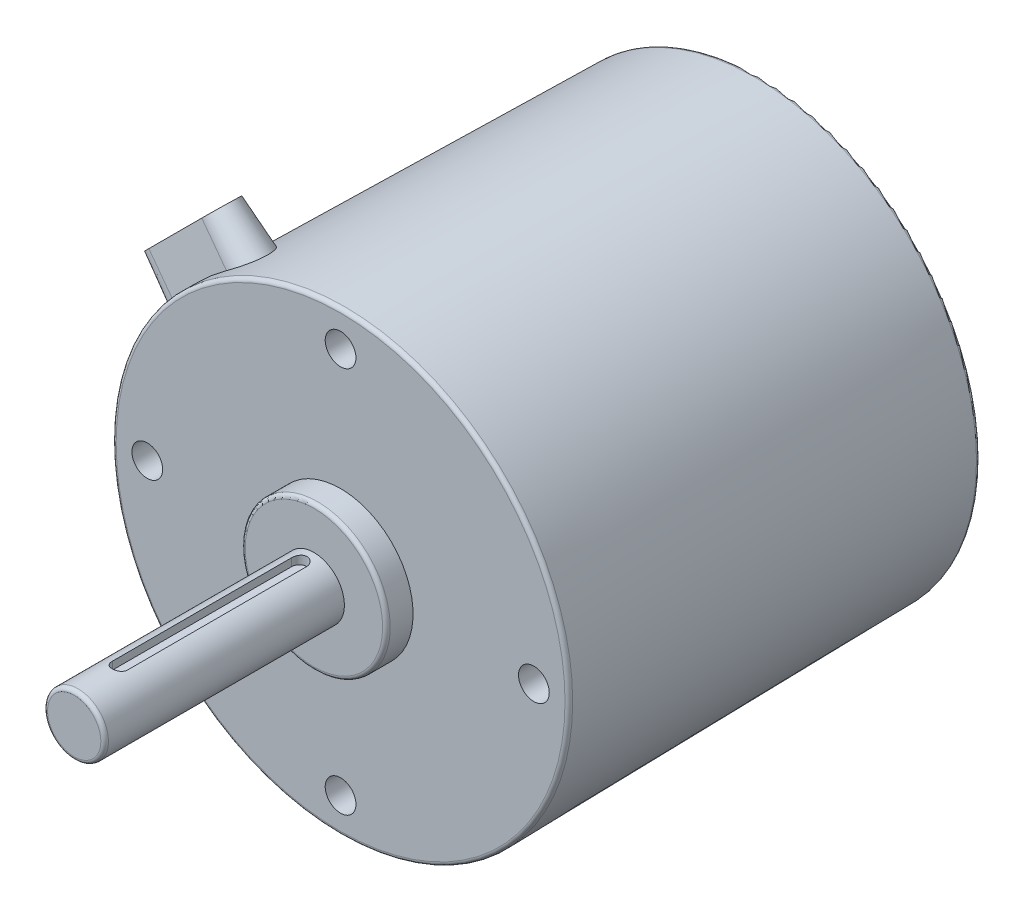
ISO-10303-21;
HEADER;
FILE_DESCRIPTION(('STEP AP214'),'2;1');
FILE_NAME('part.step','',(''),(''),'','','');
FILE_SCHEMA(('AUTOMOTIVE_DESIGN { 1 0 10303 214 1 1 1 1 }'));
ENDSEC;
DATA;
#1=APPLICATION_CONTEXT('core data for automotive mechanical design processes');
#2=APPLICATION_PROTOCOL_DEFINITION('international standard','automotive_design',2000,#1);
#3=PRODUCT_CONTEXT('',#1,'mechanical');
#4=PRODUCT('Part','Part','',(#3));
#5=PRODUCT_RELATED_PRODUCT_CATEGORY('part','',(#4));
#6=PRODUCT_DEFINITION_FORMATION('','',#4);
#7=PRODUCT_DEFINITION_CONTEXT('part definition',#1,'design');
#8=PRODUCT_DEFINITION('design','',#6,#7);
#9=PRODUCT_DEFINITION_SHAPE('','',#8);
#10=(LENGTH_UNIT() NAMED_UNIT(*) SI_UNIT(.MILLI.,.METRE.));
#11=(NAMED_UNIT(*) PLANE_ANGLE_UNIT() SI_UNIT($,.RADIAN.));
#12=(NAMED_UNIT(*) SI_UNIT($,.STERADIAN.) SOLID_ANGLE_UNIT());
#13=UNCERTAINTY_MEASURE_WITH_UNIT(LENGTH_MEASURE(1.E-05),#10,'distance_accuracy_value','');
#14=(GEOMETRIC_REPRESENTATION_CONTEXT(3) GLOBAL_UNCERTAINTY_ASSIGNED_CONTEXT((#13)) GLOBAL_UNIT_ASSIGNED_CONTEXT((#10,
#11,#12)) REPRESENTATION_CONTEXT('',''));
#15=CARTESIAN_POINT('',(0.,0.,0.));
#16=DIRECTION('',(0.,0.,1.));
#17=DIRECTION('',(1.,0.,0.));
#18=AXIS2_PLACEMENT_3D('',#15,#16,#17);
#19=CARTESIAN_POINT('',(0.,2.85,29.));
#20=DIRECTION('',(0.,1.,0.));
#21=DIRECTION('',(0.,0.,1.));
#22=AXIS2_PLACEMENT_3D('',#19,#20,#21);
#23=PLANE('',#22);
#24=DIRECTION('',(0.,0.,1.));
#25=VECTOR('',#24,1.);
#26=CARTESIAN_POINT('',(-1.,2.85,29.));
#27=LINE('',#26,#25);
#28=CARTESIAN_POINT('',(-1.,2.85,5.42));
#29=VERTEX_POINT('',#28);
#30=CARTESIAN_POINT('',(-1.,2.85,29.));
#31=VERTEX_POINT('',#30);
#32=EDGE_CURVE('E231',#29,#31,#27,.T.);
#33=ORIENTED_EDGE('',*,*,#32,.T.);
#34=CARTESIAN_POINT('',(0.,2.85,29.));
#35=DIRECTION('',(0.,1.,0.));
#36=DIRECTION('',(0.,0.,1.));
#37=AXIS2_PLACEMENT_3D('',#34,#35,#36);
#38=CIRCLE('',#37,1.);
#39=CARTESIAN_POINT('',(1.,2.85,29.));
#40=VERTEX_POINT('',#39);
#41=EDGE_CURVE('E126',#31,#40,#38,.T.);
#42=ORIENTED_EDGE('',*,*,#41,.T.);
#43=DIRECTION('',(0.,0.,-1.));
#44=VECTOR('',#43,1.);
#45=CARTESIAN_POINT('',(1.,2.85,29.));
#46=LINE('',#45,#44);
#47=CARTESIAN_POINT('',(1.,2.85,5.42));
#48=VERTEX_POINT('',#47);
#49=EDGE_CURVE('E121',#40,#48,#46,.T.);
#50=ORIENTED_EDGE('',*,*,#49,.T.);
#51=CARTESIAN_POINT('',(0.,2.85,5.42));
#52=DIRECTION('',(0.,1.,0.));
#53=DIRECTION('',(0.,0.,1.));
#54=AXIS2_PLACEMENT_3D('',#51,#52,#53);
#55=CIRCLE('',#54,1.);
#56=EDGE_CURVE('E123',#48,#29,#55,.T.);
#57=ORIENTED_EDGE('',*,*,#56,.T.);
#58=EDGE_LOOP('',(#33,#42,#50,#57));
#59=FACE_BOUND('',#58,.T.);
#60=ADVANCED_FACE('F16',(#59),#23,.T.);
#61=CARTESIAN_POINT('',(0.,0.,35.));
#62=DIRECTION('',(0.,0.,1.));
#63=DIRECTION('',(1.,0.,0.));
#64=AXIS2_PLACEMENT_3D('',#61,#62,#63);
#65=PLANE('',#64);
#66=CARTESIAN_POINT('',(0.,0.,35.));
#67=DIRECTION('',(0.,0.,-1.));
#68=DIRECTION('',(1.,0.,0.));
#69=AXIS2_PLACEMENT_3D('',#66,#67,#68);
#70=CIRCLE('',#69,3.5);
#71=CARTESIAN_POINT('',(3.5,0.,35.));
#72=VERTEX_POINT('',#71);
#73=CARTESIAN_POINT('',(0.,-3.5,35.));
#74=VERTEX_POINT('',#73);
#75=EDGE_CURVE('E232',#72,#74,#70,.T.);
#76=ORIENTED_EDGE('',*,*,#75,.F.);
#77=CARTESIAN_POINT('',(0.,0.,35.));
#78=DIRECTION('',(0.,0.,-1.));
#79=DIRECTION('',(0.,1.,0.));
#80=AXIS2_PLACEMENT_3D('',#77,#78,#79);
#81=CIRCLE('',#80,3.5);
#82=CARTESIAN_POINT('',(0.,3.5,35.));
#83=VERTEX_POINT('',#82);
#84=EDGE_CURVE('E187',#83,#72,#81,.T.);
#85=ORIENTED_EDGE('',*,*,#84,.F.);
#86=CARTESIAN_POINT('',(0.,0.,35.));
#87=DIRECTION('',(0.,0.,-1.));
#88=DIRECTION('',(-1.,0.,0.));
#89=AXIS2_PLACEMENT_3D('',#86,#87,#88);
#90=CIRCLE('',#89,3.5);
#91=CARTESIAN_POINT('',(-3.5,0.,35.));
#92=VERTEX_POINT('',#91);
#93=EDGE_CURVE('E153',#92,#83,#90,.T.);
#94=ORIENTED_EDGE('',*,*,#93,.F.);
#95=CARTESIAN_POINT('',(0.,0.,35.));
#96=DIRECTION('',(0.,0.,-1.));
#97=DIRECTION('',(0.,-1.,0.));
#98=AXIS2_PLACEMENT_3D('',#95,#96,#97);
#99=CIRCLE('',#98,3.5);
#100=EDGE_CURVE('E234',#74,#92,#99,.T.);
#101=ORIENTED_EDGE('',*,*,#100,.F.);
#102=EDGE_LOOP('',(#76,#85,#94,#101));
#103=FACE_BOUND('',#102,.T.);
#104=ADVANCED_FACE('F159',(#103),#65,.T.);
#105=CARTESIAN_POINT('',(0.,2.85,5.42));
#106=DIRECTION('',(0.,1.,0.));
#107=DIRECTION('',(0.,0.,1.));
#108=AXIS2_PLACEMENT_3D('',#105,#106,#107);
#109=CYLINDRICAL_SURFACE('',#108,1.);
#110=CARTESIAN_POINT('',(-1.,3.87298334620742,5.41999999999999));
#111=CARTESIAN_POINT('',(-1.00000033749611,3.87298148580177,5.39233701489345));
#112=CARTESIAN_POINT('',(-0.998851407375367,3.87328009949471,5.36468773698176));
#113=CARTESIAN_POINT('',(-0.994271295395754,3.87445904774559,5.30959596469643));
#114=CARTESIAN_POINT('',(-0.990840497572679,3.87533928441687,5.2821534363129));
#115=CARTESIAN_POINT('',(-0.977175239382526,3.87881710972054,5.20054682679115));
#116=CARTESIAN_POINT('',(-0.963567695172493,3.88225203148809,5.14694353151778));
#117=CARTESIAN_POINT('',(-0.927798076247996,3.89095422588003,5.04287532621803));
#118=CARTESIAN_POINT('',(-0.905636805423835,3.8962213263093,4.99241012178714));
#119=CARTESIAN_POINT('',(-0.853415378025864,3.90799134471939,4.89588855135267));
#120=CARTESIAN_POINT('',(-0.82335310335693,3.91449459395647,4.84983337210903));
#121=CARTESIAN_POINT('',(-0.755484471828066,3.92816262398025,4.76245611809389));
#122=CARTESIAN_POINT('',(-0.717537268783973,3.93533791028916,4.72124511375447));
#123=CARTESIAN_POINT('',(-0.635275780516227,3.94945104396194,4.64569791051729));
#124=CARTESIAN_POINT('',(-0.590960479478827,3.95638885322537,4.61136281053205));
#125=CARTESIAN_POINT('',(-0.496456899401686,3.96936182283248,4.55008899838135));
#126=CARTESIAN_POINT('',(-0.446195340334469,3.9753830468173,4.52326010401602));
#127=CARTESIAN_POINT('',(-0.341702590842914,3.98572346250589,4.47847526580329));
#128=CARTESIAN_POINT('',(-0.287472184083004,3.99004298914701,4.46051757570016));
#129=CARTESIAN_POINT('',(-0.177744108525155,3.99641900005128,4.43434100722256));
#130=CARTESIAN_POINT('',(-0.122294322002852,3.99851952901301,4.42593232757717));
#131=CARTESIAN_POINT('',(-0.0107327756816736,4.00037438150816,4.4184966284567));
#132=CARTESIAN_POINT('',(0.0453789000287116,4.00012899993445,4.41946842980766));
#133=CARTESIAN_POINT('',(0.155352492972102,3.99735237365736,4.43062996368545));
#134=CARTESIAN_POINT('',(0.209236701739861,3.99487198677361,4.44061461659948));
#135=CARTESIAN_POINT('',(0.314538711084345,3.98796330636496,4.46918867918275));
#136=CARTESIAN_POINT('',(0.365956402423993,3.98353492665556,4.48777846956858));
#137=CARTESIAN_POINT('',(0.465407286024544,3.97314997761798,4.53320128067065));
#138=CARTESIAN_POINT('',(0.513405629602253,3.96717993827555,4.56010739423284));
#139=CARTESIAN_POINT('',(0.604276631230019,3.95435945541919,4.62134312983347));
#140=CARTESIAN_POINT('',(0.647148515562294,3.94750887933198,4.65567387025322));
#141=CARTESIAN_POINT('',(0.727769389708495,3.93345566022865,4.73187891208131));
#142=CARTESIAN_POINT('',(0.765349103054131,3.92624850477685,4.77393163653981));
#143=CARTESIAN_POINT('',(0.832969575186241,3.91246168284006,4.86382986692774));
#144=CARTESIAN_POINT('',(0.863008270245065,3.90588218842993,4.91167695328356));
#145=CARTESIAN_POINT('',(0.914804709285965,3.89407813586325,5.01214559782377));
#146=CARTESIAN_POINT('',(0.936517017887272,3.88886106009137,5.06479146489609));
#147=CARTESIAN_POINT('',(0.970702351849831,3.88047058807055,5.17311692841829));
#148=CARTESIAN_POINT('',(0.983189189212133,3.87729413761435,5.22879185514985));
#149=CARTESIAN_POINT('',(0.993904635150938,3.87455290681524,5.3074573807589));
#150=CARTESIAN_POINT('',(0.996190790966709,3.8739652311086,5.32991970321318));
#151=CARTESIAN_POINT('',(0.999236757697394,3.87318062488975,5.37491778990932));
#152=CARTESIAN_POINT('',(0.999999038096046,3.87298306219461,5.39745337595529));
#153=CARTESIAN_POINT('',(1.,3.87298334620742,5.42));
#154=B_SPLINE_CURVE_WITH_KNOTS('',3,(#110,#111,#112,#113,#114,#115,#116,#117,#118,#119,#120,
#121,#122,#123,#124,#125,#126,#127,#128,#129,#130,#131,#132,#133,#134,#135,#136,#137,#138,#139,
#140,#141,#142,#143,#144,#145,#146,#147,#148,#149,#150,#151,#152,#153),.UNSPECIFIED.,.F.,.F.,(4,
2,2,2,2,2,2,2,2,2,2,2,2,2,2,2,2,2,2,2,2,4),(0.,0.0829365303397693,0.165859106084651,
0.331229963080318,0.496585282091499,0.66198497472675,0.830641897427976,0.999325753539195,
1.17036187098235,1.34136430732425,1.50890481515325,1.67642426256639,1.84022545479276,
2.00403389475838,2.16932509450377,2.33464120964329,2.50441429534542,2.67423379180968,
2.84496720161068,3.01544447539986,3.08315848722648,3.15076267731671),.UNSPECIFIED.);
#155=CARTESIAN_POINT('',(-1.,3.87298334620742,5.41999999999999));
#156=VERTEX_POINT('',#155);
#157=CARTESIAN_POINT('',(1.,3.87298334620742,5.42));
#158=VERTEX_POINT('',#157);
#159=EDGE_CURVE('E235',#156,#158,#154,.T.);
#160=ORIENTED_EDGE('',*,*,#159,.F.);
#161=DIRECTION('',(0.,1.,0.));
#162=VECTOR('',#161,1.);
#163=CARTESIAN_POINT('',(-1.,2.85,5.41999999999999));
#164=LINE('',#163,#162);
#165=EDGE_CURVE('E137',#156,#29,#164,.F.);
#166=ORIENTED_EDGE('',*,*,#165,.T.);
#167=ORIENTED_EDGE('',*,*,#56,.F.);
#168=DIRECTION('',(0.,1.,0.));
#169=VECTOR('',#168,1.);
#170=CARTESIAN_POINT('',(1.,2.85,5.42));
#171=LINE('',#170,#169);
#172=EDGE_CURVE('E131',#48,#158,#171,.T.);
#173=ORIENTED_EDGE('',*,*,#172,.T.);
#174=EDGE_LOOP('',(#160,#166,#167,#173));
#175=FACE_BOUND('',#174,.T.);
#176=ADVANCED_FACE('F134',(#175),#109,.F.);
#177=CARTESIAN_POINT('',(1.,2.85,29.));
#178=DIRECTION('',(1.,0.,0.));
#179=DIRECTION('',(0.,0.,-1.));
#180=AXIS2_PLACEMENT_3D('',#177,#178,#179);
#181=PLANE('',#180);
#182=DIRECTION('',(0.,0.,-1.));
#183=VECTOR('',#182,1.);
#184=CARTESIAN_POINT('',(1.,3.87298334620742,81.3137084989848));
#185=LINE('',#184,#183);
#186=CARTESIAN_POINT('',(1.,3.87298334620742,29.));
#187=VERTEX_POINT('',#186);
#188=EDGE_CURVE('E142',#158,#187,#185,.F.);
#189=ORIENTED_EDGE('',*,*,#188,.F.);
#190=ORIENTED_EDGE('',*,*,#172,.F.);
#191=ORIENTED_EDGE('',*,*,#49,.F.);
#192=DIRECTION('',(0.,1.,0.));
#193=VECTOR('',#192,1.);
#194=CARTESIAN_POINT('',(1.,2.85,29.));
#195=LINE('',#194,#193);
#196=EDGE_CURVE('E144',#40,#187,#195,.T.);
#197=ORIENTED_EDGE('',*,*,#196,.T.);
#198=EDGE_LOOP('',(#189,#190,#191,#197));
#199=FACE_BOUND('',#198,.T.);
#200=ADVANCED_FACE('F140',(#199),#181,.F.);
#201=CARTESIAN_POINT('',(0.,2.85,29.));
#202=DIRECTION('',(0.,1.,0.));
#203=DIRECTION('',(0.,0.,1.));
#204=AXIS2_PLACEMENT_3D('',#201,#202,#203);
#205=CYLINDRICAL_SURFACE('',#204,1.);
#206=ORIENTED_EDGE('',*,*,#41,.F.);
#207=DIRECTION('',(0.,1.,0.));
#208=VECTOR('',#207,1.);
#209=CARTESIAN_POINT('',(-1.,2.85,29.));
#210=LINE('',#209,#208);
#211=CARTESIAN_POINT('',(-1.,3.87298334620742,29.));
#212=VERTEX_POINT('',#211);
#213=EDGE_CURVE('E230',#31,#212,#210,.T.);
#214=ORIENTED_EDGE('',*,*,#213,.T.);
#215=CARTESIAN_POINT('',(1.,3.87298334620742,29.));
#216=CARTESIAN_POINT('',(1.00000033683282,3.87298148578629,29.0276629618861));
#217=CARTESIAN_POINT('',(0.998851408973519,3.87328009898514,29.0553122166168));
#218=CARTESIAN_POINT('',(0.99427130530857,3.87445904529398,29.1104039432582));
#219=CARTESIAN_POINT('',(0.990840513520935,3.87533928052184,29.1378464491771));
#220=CARTESIAN_POINT('',(0.977175260843418,3.87881710393726,29.2194530833432));
#221=CARTESIAN_POINT('',(0.963567703685294,3.88225202757007,29.2730564246122));
#222=CARTESIAN_POINT('',(0.927797766664209,3.89095430304382,29.377125593587));
#223=CARTESIAN_POINT('',(0.905636046675286,3.8962215135378,29.4275916629555));
#224=CARTESIAN_POINT('',(0.853414285079078,3.90799157486739,29.5241130864299));
#225=CARTESIAN_POINT('',(0.823352404294531,3.91449471333242,29.5701674100591));
#226=CARTESIAN_POINT('',(0.755487979247936,3.92816193945039,29.6575394864378));
#227=CARTESIAN_POINT('',(0.717545201468672,3.93533648748831,29.6987466452781));
#228=CARTESIAN_POINT('',(0.635284227526788,3.94944965646412,29.774295287631));
#229=CARTESIAN_POINT('',(0.59096375271655,3.95638819197842,29.8086343067441));
#230=CARTESIAN_POINT('',(0.496434353262429,3.96936513280701,29.8699263913366));
#231=CARTESIAN_POINT('',(0.446150035120257,3.97538918749288,29.8967663594361));
#232=CARTESIAN_POINT('',(0.341642316384402,3.98572777190495,29.9415435234846));
#233=CARTESIAN_POINT('',(0.287423727052291,3.99004434937703,29.9594913901323));
#234=CARTESIAN_POINT('',(0.194111735626861,3.99546891720265,29.9817561327113));
#235=CARTESIAN_POINT('',(0.155632918020192,3.99715927898668,29.9885857933547));
#236=CARTESIAN_POINT('',(0.0781080027780891,3.99942531582646,29.9977085408135));
#237=CARTESIAN_POINT('',(0.039061913421891,4.00000100713419,30.0000016937716));
#238=CARTESIAN_POINT('',(-0.0552317459834105,3.99999857595865,29.999997605085));
#239=CARTESIAN_POINT('',(-0.110495128478854,3.99884417849432,29.9954072017814));
#240=CARTESIAN_POINT('',(-0.219452299234435,3.99434884496973,29.9771887284744));
#241=CARTESIAN_POINT('',(-0.273144540728275,3.99100582520556,29.9635520456883));
#242=CARTESIAN_POINT('',(-0.377348216031214,3.98250401525139,29.9277065776784));
#243=CARTESIAN_POINT('',(-0.42786388192617,3.97734770399773,29.9055094913299));
#244=CARTESIAN_POINT('',(-0.524450982676887,3.96576858613919,29.8532106110736));
#245=CARTESIAN_POINT('',(-0.570522530531435,3.9593458117488,29.8231090182229));
#246=CARTESIAN_POINT('',(-0.657866871057287,3.94578291730051,29.7552003629653));
#247=CARTESIAN_POINT('',(-0.699035148909379,3.93863172676562,29.7172610821916));
#248=CARTESIAN_POINT('',(-0.774497762760067,3.92449111086287,29.6350335448416));
#249=CARTESIAN_POINT('',(-0.808791004318433,3.917501711407,29.59074427933));
#250=CARTESIAN_POINT('',(-0.870026617564658,3.90436326544461,29.4962571540367));
#251=CARTESIAN_POINT('',(-0.896849892050566,3.89822853701072,29.4459800204073));
#252=CARTESIAN_POINT('',(-0.941609493202656,3.88766043493568,29.3414633719414));
#253=CARTESIAN_POINT('',(-0.959552492279168,3.88322578446617,29.2872268673445));
#254=CARTESIAN_POINT('',(-0.981793057388554,3.87765011739136,29.1939162001483));
#255=CARTESIAN_POINT('',(-0.988610024876979,3.87591131774124,29.1554596460299));
#256=CARTESIAN_POINT('',(-0.997716332082784,3.87357302813837,29.0780089785749));
#257=CARTESIAN_POINT('',(-1.00000893261029,3.87297271766376,29.0390152728012));
#258=CARTESIAN_POINT('',(-1.,3.87298334620742,29.));
#259=B_SPLINE_CURVE_WITH_KNOTS('',3,(#215,#216,#217,#218,#219,#220,#221,#222,#223,#224,#225,
#226,#227,#228,#229,#230,#231,#232,#233,#234,#235,#236,#237,#238,#239,#240,#241,#242,#243,#244,
#245,#246,#247,#248,#249,#250,#251,#252,#253,#254,#255,#256,#257,#258),.UNSPECIFIED.,.F.,.F.,(4,
2,2,2,2,2,2,2,2,2,2,2,2,2,2,2,2,2,2,2,2,4),(0.,0.0829364608197415,0.165858967679138,
0.331229962709977,0.496588203456508,0.661984974171244,0.830625162094531,0.999325752711569,
1.17044795789403,1.34136431261154,1.45844938979969,1.57553275986414,1.74108325106594,
1.90679158624143,2.07227425793992,2.23775272086786,2.40629176845253,2.57485762457944,
2.74597444954044,2.91696250578419,3.03398040676349,3.15091393953945),.UNSPECIFIED.);
#260=EDGE_CURVE('E239',#187,#212,#259,.T.);
#261=ORIENTED_EDGE('',*,*,#260,.F.);
#262=ORIENTED_EDGE('',*,*,#196,.F.);
#263=EDGE_LOOP('',(#206,#214,#261,#262));
#264=FACE_BOUND('',#263,.T.);
#265=ADVANCED_FACE('F576',(#264),#205,.F.);
#266=CARTESIAN_POINT('',(-1.,2.85,29.));
#267=DIRECTION('',(-1.,0.,0.));
#268=DIRECTION('',(0.,0.,1.));
#269=AXIS2_PLACEMENT_3D('',#266,#267,#268);
#270=PLANE('',#269);
#271=DIRECTION('',(0.,0.,-1.));
#272=VECTOR('',#271,1.);
#273=CARTESIAN_POINT('',(-1.,3.87298334620742,81.3137084989848));
#274=LINE('',#273,#272);
#275=EDGE_CURVE('E229',#212,#156,#274,.T.);
#276=ORIENTED_EDGE('',*,*,#275,.F.);
#277=ORIENTED_EDGE('',*,*,#213,.F.);
#278=ORIENTED_EDGE('',*,*,#32,.F.);
#279=ORIENTED_EDGE('',*,*,#165,.F.);
#280=EDGE_LOOP('',(#276,#277,#278,#279));
#281=FACE_BOUND('',#280,.T.);
#282=ADVANCED_FACE('F214',(#281),#270,.F.);
#283=CARTESIAN_POINT('',(0.,0.,34.5));
#284=DIRECTION('',(0.,0.,1.));
#285=DIRECTION('',(0.,-1.,0.));
#286=AXIS2_PLACEMENT_3D('',#283,#284,#285);
#287=TOROIDAL_SURFACE('',#286,3.5,0.5);
#288=CARTESIAN_POINT('',(0.,0.,34.5));
#289=DIRECTION('',(0.,0.,-1.));
#290=DIRECTION('',(-1.,0.,0.));
#291=AXIS2_PLACEMENT_3D('',#288,#289,#290);
#292=CIRCLE('',#291,4.);
#293=CARTESIAN_POINT('',(-4.,0.,34.5));
#294=VERTEX_POINT('',#293);
#295=EDGE_CURVE('E225',#294,#294,#292,.T.);
#296=ORIENTED_EDGE('',*,*,#295,.F.);
#297=EDGE_LOOP('',(#296));
#298=FACE_BOUND('',#297,.T.);
#299=ORIENTED_EDGE('',*,*,#100,.T.);
#300=ORIENTED_EDGE('',*,*,#93,.T.);
#301=ORIENTED_EDGE('',*,*,#84,.T.);
#302=ORIENTED_EDGE('',*,*,#75,.T.);
#303=EDGE_LOOP('',(#299,#300,#301,#302));
#304=FACE_BOUND('',#303,.T.);
#305=ADVANCED_FACE('F202',(#298,#304),#287,.T.);
#306=CARTESIAN_POINT('',(0.,0.,81.3137084989848));
#307=DIRECTION('',(0.,0.,-1.));
#308=DIRECTION('',(-1.,0.,0.));
#309=AXIS2_PLACEMENT_3D('',#306,#307,#308);
#310=CYLINDRICAL_SURFACE('',#309,4.);
#311=CARTESIAN_POINT('',(0.,0.,3.5));
#312=DIRECTION('',(0.,0.,-1.));
#313=DIRECTION('',(-1.,0.,0.));
#314=AXIS2_PLACEMENT_3D('',#311,#312,#313);
#315=CIRCLE('',#314,4.);
#316=CARTESIAN_POINT('',(-4.,0.,3.5));
#317=VERTEX_POINT('',#316);
#318=EDGE_CURVE('E228',#317,#317,#315,.T.);
#319=ORIENTED_EDGE('',*,*,#318,.F.);
#320=EDGE_LOOP('',(#319));
#321=FACE_BOUND('',#320,.T.);
#322=ORIENTED_EDGE('',*,*,#295,.T.);
#323=EDGE_LOOP('',(#322));
#324=FACE_BOUND('',#323,.T.);
#325=ORIENTED_EDGE('',*,*,#260,.T.);
#326=ORIENTED_EDGE('',*,*,#275,.T.);
#327=ORIENTED_EDGE('',*,*,#159,.T.);
#328=ORIENTED_EDGE('',*,*,#188,.T.);
#329=EDGE_LOOP('',(#325,#326,#327,#328));
#330=FACE_BOUND('',#329,.T.);
#331=ADVANCED_FACE('F213',(#321,#324,#330),#310,.T.);
#332=CARTESIAN_POINT('',(0.,0.,3.5));
#333=DIRECTION('',(0.,0.,1.));
#334=DIRECTION('',(1.,0.,0.));
#335=AXIS2_PLACEMENT_3D('',#332,#333,#334);
#336=PLANE('',#335);
#337=ORIENTED_EDGE('',*,*,#318,.T.);
#338=EDGE_LOOP('',(#337));
#339=FACE_BOUND('',#338,.T.);
#340=CARTESIAN_POINT('',(0.,0.,3.5));
#341=DIRECTION('',(0.,0.,-1.));
#342=DIRECTION('',(-1.,0.,0.));
#343=AXIS2_PLACEMENT_3D('',#340,#341,#342);
#344=CIRCLE('',#343,9.025);
#345=CARTESIAN_POINT('',(-9.025,0.,3.5));
#346=VERTEX_POINT('',#345);
#347=CARTESIAN_POINT('',(9.025,0.,3.5));
#348=VERTEX_POINT('',#347);
#349=EDGE_CURVE('E481',#346,#348,#344,.T.);
#350=ORIENTED_EDGE('',*,*,#349,.F.);
#351=CARTESIAN_POINT('',(0.,0.,3.5));
#352=DIRECTION('',(0.,0.,-1.));
#353=DIRECTION('',(1.,0.,0.));
#354=AXIS2_PLACEMENT_3D('',#351,#352,#353);
#355=CIRCLE('',#354,9.025);
#356=EDGE_CURVE('E497',#348,#346,#355,.T.);
#357=ORIENTED_EDGE('',*,*,#356,.F.);
#358=EDGE_LOOP('',(#350,#357));
#359=FACE_BOUND('',#358,.T.);
#360=ADVANCED_FACE('F501',(#339,#359),#336,.T.);
#361=CARTESIAN_POINT('',(0.,25.4,-5.50000000004047));
#362=DIRECTION('',(0.,0.,1.));
#363=DIRECTION('',(1.,0.,0.));
#364=AXIS2_PLACEMENT_3D('',#361,#362,#363);
#365=CONICAL_SURFACE('',#364,2.0192999998585,1.02974425846506);
#366=CARTESIAN_POINT('',(0.,25.4,-6.71331784838003));
#367=VERTEX_POINT('',#366);
#368=VERTEX_LOOP('',#367);
#369=FACE_BOUND('',#368,.T.);
#370=CARTESIAN_POINT('',(0.,25.4,-5.5));
#371=DIRECTION('',(0.,0.,1.));
#372=DIRECTION('',(1.,0.,0.));
#373=AXIS2_PLACEMENT_3D('',#370,#371,#372);
#374=CIRCLE('',#373,2.01929999999999);
#375=CARTESIAN_POINT('',(2.0193,25.4,-5.5));
#376=VERTEX_POINT('',#375);
#377=EDGE_CURVE('E502',#376,#376,#374,.T.);
#378=ORIENTED_EDGE('',*,*,#377,.T.);
#379=EDGE_LOOP('',(#378));
#380=FACE_BOUND('',#379,.T.);
#381=ADVANCED_FACE('F517',(#369,#380),#365,.F.);
#382=CARTESIAN_POINT('',(25.4,0.,-5.50000000004047));
#383=DIRECTION('',(0.,0.,1.));
#384=DIRECTION('',(1.,0.,0.));
#385=AXIS2_PLACEMENT_3D('',#382,#383,#384);
#386=CONICAL_SURFACE('',#385,2.01929999990589,1.02974425838645);
#387=CARTESIAN_POINT('',(25.4000000000758,0.,-6.71331784849372));
#388=VERTEX_POINT('',#387);
#389=VERTEX_LOOP('',#388);
#390=FACE_BOUND('',#389,.T.);
#391=CARTESIAN_POINT('',(25.4,0.,-5.5));
#392=DIRECTION('',(0.,0.,1.));
#393=DIRECTION('',(1.,0.,0.));
#394=AXIS2_PLACEMENT_3D('',#391,#392,#393);
#395=CIRCLE('',#394,2.01929999999999);
#396=CARTESIAN_POINT('',(27.4193,0.,-5.5));
#397=VERTEX_POINT('',#396);
#398=EDGE_CURVE('E539',#397,#397,#395,.T.);
#399=ORIENTED_EDGE('',*,*,#398,.T.);
#400=EDGE_LOOP('',(#399));
#401=FACE_BOUND('',#400,.T.);
#402=ADVANCED_FACE('F522',(#390,#401),#386,.F.);
#403=CARTESIAN_POINT('',(0.,-25.4,-5.50000000004047));
#404=DIRECTION('',(0.,0.,1.));
#405=DIRECTION('',(1.,0.,0.));
#406=AXIS2_PLACEMENT_3D('',#403,#404,#405);
#407=CONICAL_SURFACE('',#406,2.0192999998585,1.02974425846506);
#408=CARTESIAN_POINT('',(0.,-25.4,-6.71331784838003));
#409=VERTEX_POINT('',#408);
#410=VERTEX_LOOP('',#409);
#411=FACE_BOUND('',#410,.T.);
#412=CARTESIAN_POINT('',(0.,-25.4,-5.5));
#413=DIRECTION('',(0.,0.,1.));
#414=DIRECTION('',(1.,0.,0.));
#415=AXIS2_PLACEMENT_3D('',#412,#413,#414);
#416=CIRCLE('',#415,2.01929999999999);
#417=CARTESIAN_POINT('',(2.0193,-25.4,-5.5));
#418=VERTEX_POINT('',#417);
#419=EDGE_CURVE('E537',#418,#418,#416,.T.);
#420=ORIENTED_EDGE('',*,*,#419,.T.);
#421=EDGE_LOOP('',(#420));
#422=FACE_BOUND('',#421,.T.);
#423=ADVANCED_FACE('F525',(#411,#422),#407,.F.);
#424=CARTESIAN_POINT('',(-25.4,0.,-5.50000000009732));
#425=DIRECTION('',(0.,0.,1.));
#426=DIRECTION('',(1.,0.,0.));
#427=AXIS2_PLACEMENT_3D('',#424,#425,#426);
#428=CONICAL_SURFACE('',#427,2.01929999975427,1.0297442583699);
#429=CARTESIAN_POINT('',(-25.3999999999053,0.,-6.71331784877793));
#430=VERTEX_POINT('',#429);
#431=VERTEX_LOOP('',#430);
#432=FACE_BOUND('',#431,.T.);
#433=CARTESIAN_POINT('',(-25.4,0.,-5.5));
#434=DIRECTION('',(0.,0.,1.));
#435=DIRECTION('',(1.,0.,0.));
#436=AXIS2_PLACEMENT_3D('',#433,#434,#435);
#437=CIRCLE('',#436,2.01929999999999);
#438=CARTESIAN_POINT('',(-23.3807,0.,-5.5));
#439=VERTEX_POINT('',#438);
#440=EDGE_CURVE('E441',#439,#439,#437,.T.);
#441=ORIENTED_EDGE('',*,*,#440,.T.);
#442=EDGE_LOOP('',(#441));
#443=FACE_BOUND('',#442,.T.);
#444=ADVANCED_FACE('F452',(#432,#443),#428,.F.);
#445=CARTESIAN_POINT('',(0.,0.,3.));
#446=DIRECTION('',(0.,0.,1.));
#447=DIRECTION('',(1.,0.,0.));
#448=AXIS2_PLACEMENT_3D('',#445,#446,#447);
#449=TOROIDAL_SURFACE('',#448,9.025,0.500000000000001);
#450=CARTESIAN_POINT('',(0.,0.,3.));
#451=DIRECTION('',(0.,0.,-1.));
#452=DIRECTION('',(-1.,0.,0.));
#453=AXIS2_PLACEMENT_3D('',#450,#451,#452);
#454=CIRCLE('',#453,9.525);
#455=CARTESIAN_POINT('',(-9.525,0.,3.));
#456=VERTEX_POINT('',#455);
#457=EDGE_CURVE('E433',#456,#456,#454,.T.);
#458=ORIENTED_EDGE('',*,*,#457,.F.);
#459=EDGE_LOOP('',(#458));
#460=FACE_BOUND('',#459,.T.);
#461=ORIENTED_EDGE('',*,*,#356,.T.);
#462=ORIENTED_EDGE('',*,*,#349,.T.);
#463=EDGE_LOOP('',(#461,#462));
#464=FACE_BOUND('',#463,.T.);
#465=ADVANCED_FACE('F446',(#460,#464),#449,.T.);
#466=CARTESIAN_POINT('',(-28.1363670181608,21.2313063320783,-5.30190195474243));
#467=DIRECTION('',(-0.706999085398821,0.706999085398828,-0.0174524064372836));
#468=DIRECTION('',(-0.707106781186551,-0.707106781186544,0.));
#469=AXIS2_PLACEMENT_3D('',#466,#467,#468);
#470=PLANE('',#469);
#471=DIRECTION('',(0.707214460582744,0.706783775805259,-0.0174470914802136));
#472=VECTOR('',#471,1.);
#473=CARTESIAN_POINT('',(-28.1363670183226,21.1730039335373,-7.66373914380555));
#474=LINE('',#473,#472);
#475=CARTESIAN_POINT('',(-28.136367018929,21.1730039329562,-7.66373914479925));
#476=VERTEX_POINT('',#475);
#477=CARTESIAN_POINT('',(-21.3471081973529,27.9581281806545,-7.83123122371729));
#478=VERTEX_POINT('',#477);
#479=EDGE_CURVE('E434',#476,#478,#474,.T.);
#480=ORIENTED_EDGE('',*,*,#479,.F.);
#481=CARTESIAN_POINT('',(-28.1363670183494,21.2313063322669,-5.30190195474708));
#482=DIRECTION('',(0.706999085398823,-0.706999085398826,0.0174524064372831));
#483=DIRECTION('',(0.707106781186549,0.707106781186546,0.));
#484=AXIS2_PLACEMENT_3D('',#481,#482,#483);
#485=CIRCLE('',#484,2.36255668229862);
#486=CARTESIAN_POINT('',(-28.136367018286,21.2896087310604,-2.94006476570455));
#487=VERTEX_POINT('',#486);
#488=EDGE_CURVE('E566',#487,#476,#485,.T.);
#489=ORIENTED_EDGE('',*,*,#488,.F.);
#490=DIRECTION('',(-0.70721446059118,-0.706783775796902,0.0174470914768434));
#491=VECTOR('',#490,1.);
#492=CARTESIAN_POINT('',(-21.3471081967197,28.0747329786518,-3.10755684387409));
#493=LINE('',#492,#491);
#494=CARTESIAN_POINT('',(-21.3471081967079,28.07473297864,-3.10755684387696));
#495=VERTEX_POINT('',#494);
#496=EDGE_CURVE('E425',#495,#487,#493,.T.);
#497=ORIENTED_EDGE('',*,*,#496,.F.);
#498=CARTESIAN_POINT('',(-21.3471081966874,28.0164305799301,-5.46939403294529));
#499=DIRECTION('',(0.706999085398817,-0.706999085398832,0.0174524064372834));
#500=DIRECTION('',(0.707106781186555,0.70710678118654,0.));
#501=AXIS2_PLACEMENT_3D('',#498,#499,#500);
#502=CIRCLE('',#501,2.3625566823267);
#503=EDGE_CURVE('E563',#478,#495,#502,.T.);
#504=ORIENTED_EDGE('',*,*,#503,.F.);
#505=EDGE_LOOP('',(#480,#489,#497,#504));
#506=FACE_BOUND('',#505,.T.);
#507=ADVANCED_FACE('F451',(#506),#470,.T.);
#508=CARTESIAN_POINT('',(0.,25.4,0.));
#509=DIRECTION('',(0.,0.,1.));
#510=DIRECTION('',(1.,0.,0.));
#511=AXIS2_PLACEMENT_3D('',#508,#509,#510);
#512=CYLINDRICAL_SURFACE('',#511,2.01929999999999);
#513=ORIENTED_EDGE('',*,*,#377,.F.);
#514=EDGE_LOOP('',(#513));
#515=FACE_BOUND('',#514,.T.);
#516=CARTESIAN_POINT('',(0.,25.4,0.));
#517=DIRECTION('',(0.,0.,1.));
#518=DIRECTION('',(1.,0.,0.));
#519=AXIS2_PLACEMENT_3D('',#516,#517,#518);
#520=CIRCLE('',#519,2.01929999999999);
#521=CARTESIAN_POINT('',(2.0193,25.4,0.));
#522=VERTEX_POINT('',#521);
#523=EDGE_CURVE('E554',#522,#522,#520,.F.);
#524=ORIENTED_EDGE('',*,*,#523,.F.);
#525=EDGE_LOOP('',(#524));
#526=FACE_BOUND('',#525,.T.);
#527=ADVANCED_FACE('F548',(#515,#526),#512,.F.);
#528=CARTESIAN_POINT('',(25.4,0.,0.));
#529=DIRECTION('',(0.,0.,1.));
#530=DIRECTION('',(1.,0.,0.));
#531=AXIS2_PLACEMENT_3D('',#528,#529,#530);
#532=CYLINDRICAL_SURFACE('',#531,2.01929999999999);
#533=ORIENTED_EDGE('',*,*,#398,.F.);
#534=EDGE_LOOP('',(#533));
#535=FACE_BOUND('',#534,.T.);
#536=CARTESIAN_POINT('',(25.4,0.,0.));
#537=DIRECTION('',(0.,0.,1.));
#538=DIRECTION('',(1.,0.,0.));
#539=AXIS2_PLACEMENT_3D('',#536,#537,#538);
#540=CIRCLE('',#539,2.01929999999999);
#541=CARTESIAN_POINT('',(27.4193,0.,0.));
#542=VERTEX_POINT('',#541);
#543=EDGE_CURVE('E556',#542,#542,#540,.F.);
#544=ORIENTED_EDGE('',*,*,#543,.F.);
#545=EDGE_LOOP('',(#544));
#546=FACE_BOUND('',#545,.T.);
#547=ADVANCED_FACE('F551',(#535,#546),#532,.F.);
#548=CARTESIAN_POINT('',(0.,-25.4,0.));
#549=DIRECTION('',(0.,0.,1.));
#550=DIRECTION('',(1.,0.,0.));
#551=AXIS2_PLACEMENT_3D('',#548,#549,#550);
#552=CYLINDRICAL_SURFACE('',#551,2.01929999999999);
#553=ORIENTED_EDGE('',*,*,#419,.F.);
#554=EDGE_LOOP('',(#553));
#555=FACE_BOUND('',#554,.T.);
#556=CARTESIAN_POINT('',(0.,-25.4,0.));
#557=DIRECTION('',(0.,0.,1.));
#558=DIRECTION('',(1.,0.,0.));
#559=AXIS2_PLACEMENT_3D('',#556,#557,#558);
#560=CIRCLE('',#559,2.01929999999999);
#561=CARTESIAN_POINT('',(2.0193,-25.4,0.));
#562=VERTEX_POINT('',#561);
#563=EDGE_CURVE('E559',#562,#562,#560,.F.);
#564=ORIENTED_EDGE('',*,*,#563,.F.);
#565=EDGE_LOOP('',(#564));
#566=FACE_BOUND('',#565,.T.);
#567=ADVANCED_FACE('F697',(#555,#566),#552,.F.);
#568=CARTESIAN_POINT('',(-25.4,0.,0.));
#569=DIRECTION('',(0.,0.,1.));
#570=DIRECTION('',(1.,0.,0.));
#571=AXIS2_PLACEMENT_3D('',#568,#569,#570);
#572=CYLINDRICAL_SURFACE('',#571,2.01929999999999);
#573=ORIENTED_EDGE('',*,*,#440,.F.);
#574=EDGE_LOOP('',(#573));
#575=FACE_BOUND('',#574,.T.);
#576=CARTESIAN_POINT('',(-25.4,0.,0.));
#577=DIRECTION('',(0.,0.,1.));
#578=DIRECTION('',(1.,0.,0.));
#579=AXIS2_PLACEMENT_3D('',#576,#577,#578);
#580=CIRCLE('',#579,2.01929999999999);
#581=CARTESIAN_POINT('',(-23.3807,0.,0.));
#582=VERTEX_POINT('',#581);
#583=EDGE_CURVE('E807',#582,#582,#580,.F.);
#584=ORIENTED_EDGE('',*,*,#583,.F.);
#585=EDGE_LOOP('',(#584));
#586=FACE_BOUND('',#585,.T.);
#587=ADVANCED_FACE('F706',(#575,#586),#572,.F.);
#588=CARTESIAN_POINT('',(0.,0.,3.5));
#589=DIRECTION('',(0.,0.,-1.));
#590=DIRECTION('',(-1.,0.,0.));
#591=AXIS2_PLACEMENT_3D('',#588,#589,#590);
#592=CYLINDRICAL_SURFACE('',#591,9.525);
#593=ORIENTED_EDGE('',*,*,#457,.T.);
#594=EDGE_LOOP('',(#593));
#595=FACE_BOUND('',#594,.T.);
#596=CARTESIAN_POINT('',(0.,0.,0.));
#597=DIRECTION('',(0.,0.,-1.));
#598=DIRECTION('',(-1.,0.,0.));
#599=AXIS2_PLACEMENT_3D('',#596,#597,#598);
#600=CIRCLE('',#599,9.525);
#601=CARTESIAN_POINT('',(-9.525,0.,0.));
#602=VERTEX_POINT('',#601);
#603=EDGE_CURVE('E805',#602,#602,#600,.T.);
#604=ORIENTED_EDGE('',*,*,#603,.F.);
#605=EDGE_LOOP('',(#604));
#606=FACE_BOUND('',#605,.T.);
#607=ADVANCED_FACE('F372',(#595,#606),#592,.T.);
#608=CARTESIAN_POINT('',(0.,0.,-55.));
#609=DIRECTION('',(0.,0.,1.));
#610=DIRECTION('',(1.,0.,0.));
#611=AXIS2_PLACEMENT_3D('',#608,#609,#610);
#612=PLANE('',#611);
#613=CARTESIAN_POINT('',(0.,0.,-55.));
#614=DIRECTION('',(0.,0.,1.));
#615=DIRECTION('',(0.,1.,0.));
#616=AXIS2_PLACEMENT_3D('',#613,#614,#615);
#617=CIRCLE('',#616,28.5486227973902);
#618=CARTESIAN_POINT('',(0.,28.5486227973902,-55.));
#619=VERTEX_POINT('',#618);
#620=CARTESIAN_POINT('',(-28.5486227973902,0.,-55.));
#621=VERTEX_POINT('',#620);
#622=EDGE_CURVE('E258',#619,#621,#617,.T.);
#623=ORIENTED_EDGE('',*,*,#622,.F.);
#624=CARTESIAN_POINT('',(0.,0.,-55.));
#625=DIRECTION('',(0.,0.,1.));
#626=DIRECTION('',(1.,0.,0.));
#627=AXIS2_PLACEMENT_3D('',#624,#625,#626);
#628=CIRCLE('',#627,28.5486227973902);
#629=CARTESIAN_POINT('',(28.5486227973905,0.,-55.));
#630=VERTEX_POINT('',#629);
#631=EDGE_CURVE('E421',#630,#619,#628,.T.);
#632=ORIENTED_EDGE('',*,*,#631,.F.);
#633=CARTESIAN_POINT('',(0.,0.,-55.));
#634=DIRECTION('',(0.,0.,1.));
#635=DIRECTION('',(0.,-1.,0.));
#636=AXIS2_PLACEMENT_3D('',#633,#634,#635);
#637=CIRCLE('',#636,28.5486227973913);
#638=CARTESIAN_POINT('',(2.08468246512273E-08,-28.548622797391,-55.));
#639=VERTEX_POINT('',#638);
#640=EDGE_CURVE('E411',#639,#630,#637,.T.);
#641=ORIENTED_EDGE('',*,*,#640,.F.);
#642=CARTESIAN_POINT('',(0.,0.,-55.));
#643=DIRECTION('',(0.,0.,1.));
#644=DIRECTION('',(-1.,0.,0.));
#645=AXIS2_PLACEMENT_3D('',#642,#643,#644);
#646=CIRCLE('',#645,28.5486227973902);
#647=EDGE_CURVE('E399',#621,#639,#646,.T.);
#648=ORIENTED_EDGE('',*,*,#647,.F.);
#649=EDGE_LOOP('',(#623,#632,#641,#648));
#650=FACE_BOUND('',#649,.T.);
#651=ADVANCED_FACE('F367',(#650),#612,.F.);
#652=CARTESIAN_POINT('',(-24.6013715911667,17.7654083864687,-2.41549263488673));
#653=DIRECTION('',(-0.0616190304098492,0.086202796340836,0.99437023939495));
#654=DIRECTION('',(0.,-0.996263396829543,0.0863669157586442));
#655=AXIS2_PLACEMENT_3D('',#652,#653,#654);
#656=PLANE('',#655);
#657=CARTESIAN_POINT('',(-21.3471081966962,28.0747329786282,-3.10755684387982));
#658=CARTESIAN_POINT('',(-21.1885810654783,27.9166899002946,-3.08403236328818));
#659=CARTESIAN_POINT('',(-21.0300539349275,27.7586468212961,-3.06050788266796));
#660=CARTESIAN_POINT('',(-20.7129996750923,27.4425606619013,-3.01345892137961));
#661=CARTESIAN_POINT('',(-20.5544725458078,27.2845175815049,-2.98993444071149));
#662=CARTESIAN_POINT('',(-20.2374182886372,26.9684314194458,-2.94288547936624));
#663=CARTESIAN_POINT('',(-20.078891160751,26.8103883377831,-2.91936099868911));
#664=CARTESIAN_POINT('',(-19.761836906283,26.494302173099,-2.87231203727777));
#665=CARTESIAN_POINT('',(-19.6033097797012,26.3362590900776,-2.84878755654354));
#666=CARTESIAN_POINT('',(-19.2862555278706,26.0201729227016,-2.80173859504919));
#667=CARTESIAN_POINT('',(-19.127728402622,25.8621298383468,-2.77821411428906));
#668=CARTESIAN_POINT('',(-18.8106741534752,25.5460436683263,-2.73116515273073));
#669=CARTESIAN_POINT('',(-18.6521470295772,25.3880005826605,-2.70764067193252));
#670=CARTESIAN_POINT('',(-18.3350927830573,25.0719144099393,-2.66059171030602));
#671=CARTESIAN_POINT('',(-18.1765656604354,24.9138713228838,-2.63706722947773));
#672=CARTESIAN_POINT('',(-17.8595114165904,24.5977851475073,-2.59001826780331));
#673=CARTESIAN_POINT('',(-17.7009842953673,24.4397420591862,-2.56649378695717));
#674=CARTESIAN_POINT('',(-17.54245717481,24.2816989701997,-2.54296930609417));
#675=B_SPLINE_CURVE_WITH_KNOTS('',3,(#657,#658,#659,#660,#661,#662,#663,#664,#665,#666,#667,
#668,#669,#670,#671,#672,#673,#674),.UNSPECIFIED.,.F.,.F.,(4,2,2,2,2,2,2,2,4),(0.,
0.675245736125716,1.35049147253528,2.02573720866099,2.70098294491036,3.37622868115975,
4.05147441732901,4.72672015373857,5.40196588986429),.UNSPECIFIED.);
#676=CARTESIAN_POINT('',(-17.5424576702052,24.2816989408885,-2.54296933422495));
#677=VERTEX_POINT('',#676);
#678=EDGE_CURVE('E322',#495,#677,#675,.T.);
#679=ORIENTED_EDGE('',*,*,#678,.F.);
#680=ORIENTED_EDGE('',*,*,#496,.T.);
#681=DIRECTION('',(-0.704308740433795,0.702157939600404,-0.104515195089886));
#682=VECTOR('',#681,1.);
#683=CARTESIAN_POINT('',(458845.934804804,-457451.483129552,68091.2213688611));
#684=LINE('',#683,#682);
#685=CARTESIAN_POINT('',(-24.3239645841746,17.4888485184316,-2.37432709802517));
#686=VERTEX_POINT('',#685);
#687=EDGE_CURVE('E432',#686,#487,#684,.T.);
#688=ORIENTED_EDGE('',*,*,#687,.F.);
#689=CARTESIAN_POINT('',(0.0324619763785029,-0.0454131316245091,0.655049341062527));
#690=DIRECTION('',(-0.0616190304098492,0.086202796340836,0.99437023939495));
#691=DIRECTION('',(0.578249308130022,-0.808949881415111,0.105961441126617));
#692=AXIS2_PLACEMENT_3D('',#689,#690,#691);
#693=ELLIPSE('',#692,30.1813476910176,30.0113820129807);
#694=EDGE_CURVE('E357',#677,#686,#693,.T.);
#695=ORIENTED_EDGE('',*,*,#694,.F.);
#696=EDGE_LOOP('',(#679,#680,#688,#695));
#697=FACE_BOUND('',#696,.T.);
#698=ADVANCED_FACE('F363',(#697),#656,.T.);
#699=CARTESIAN_POINT('',(-23.8484146935192,16.9433540074367,-5.1960530388119));
#700=DIRECTION('',(0.706999085398823,-0.706999085398826,0.0174524064372831));
#701=DIRECTION('',(0.707106781186549,0.707106781186546,0.));
#702=AXIS2_PLACEMENT_3D('',#699,#700,#701);
#703=CONICAL_SURFACE('',#702,2.89317578196007,0.0872664625982154);
#704=DIRECTION('',(-0.704308875264514,0.706459406503352,0.0697432088920907));
#705=VECTOR('',#704,1.);
#706=CARTESIAN_POINT('',(-24.3114395323575,17.336397443752,-8.04249727964555));
#707=LINE('',#706,#705);
#708=CARTESIAN_POINT('',(-24.3114395323357,17.3363974437335,-8.04249727964759));
#709=VERTEX_POINT('',#708);
#710=EDGE_CURVE('E438',#709,#476,#707,.T.);
#711=ORIENTED_EDGE('',*,*,#710,.F.);
#712=CARTESIAN_POINT('',(-24.323964584106,17.4888485184032,-2.37432709803858));
#713=CARTESIAN_POINT('',(-24.3723630693994,17.4216251249151,-2.37149125939848));
#714=CARTESIAN_POINT('',(-24.4204939785804,17.3540689089757,-2.37217139349838));
#715=CARTESIAN_POINT('',(-24.515890188376,17.2187847628397,-2.38049674555456));
#716=CARTESIAN_POINT('',(-24.5631555796918,17.1510568514924,-2.38814122937719));
#717=CARTESIAN_POINT('',(-24.656467361635,17.0159570464187,-2.41031994049511));
#718=CARTESIAN_POINT('',(-24.7025145973307,16.9485849332939,-2.42484925182225));
#719=CARTESIAN_POINT('',(-24.7931134833666,16.8146620176344,-2.46066125783207));
#720=CARTESIAN_POINT('',(-24.8376651232025,16.7481112208703,-2.48194399993629));
#721=CARTESIAN_POINT('',(-24.9686714931288,16.5503985225202,-2.55572583127907));
#722=CARTESIAN_POINT('',(-25.0525438487385,16.4210802923311,-2.61817441630983));
#723=CARTESIAN_POINT('',(-25.2111842596906,16.1716323136113,-2.76782680711549));
#724=CARTESIAN_POINT('',(-25.2859529898568,16.0515018842628,-2.85502877639944));
#725=CARTESIAN_POINT('',(-25.4249798648278,15.8238571079557,-3.05223957828922));
#726=CARTESIAN_POINT('',(-25.4892085519006,15.716378349346,-3.16231044614824));
#727=CARTESIAN_POINT('',(-25.6054607191313,15.5181813794203,-3.40225041275293));
#728=CARTESIAN_POINT('',(-25.6574839640499,15.427463491149,-3.53211989300393));
#729=CARTESIAN_POINT('',(-25.747242984029,15.2678331232008,-3.80539645139539));
#730=CARTESIAN_POINT('',(-25.7852385160407,15.1985285430855,-3.94848874626436));
#731=CARTESIAN_POINT('',(-25.8474563494499,15.0821673273815,-4.24623818380844));
#732=CARTESIAN_POINT('',(-25.8716826396638,15.0351042493109,-4.40089196252836));
#733=CARTESIAN_POINT('',(-25.9051827031156,14.9664701439298,-4.71157772648473));
#734=CARTESIAN_POINT('',(-25.9149493623687,14.9440658446221,-4.86737273635094));
#735=CARTESIAN_POINT('',(-25.9208886818894,14.9227996241081,-5.18081086614762));
#736=CARTESIAN_POINT('',(-25.9170632664306,14.9239343705139,-5.33845372132334));
#737=CARTESIAN_POINT('',(-25.8961728013461,14.9493725503222,-5.64731345523528));
#738=CARTESIAN_POINT('',(-25.8794111803663,14.9731478810825,-5.79859492109647));
#739=CARTESIAN_POINT('',(-25.8334179003746,15.0421089108278,-6.0942099295618));
#740=CARTESIAN_POINT('',(-25.8041859635137,15.0872950868667,-6.23854331727729));
#741=CARTESIAN_POINT('',(-25.7335974722878,15.1978042582743,-6.51764603975546));
#742=CARTESIAN_POINT('',(-25.6921362112173,15.263301414554,-6.65231974813074));
#743=CARTESIAN_POINT('',(-25.5980745472723,15.4119045040449,-6.90727909585859));
#744=CARTESIAN_POINT('',(-25.5454728231133,15.4950125259458,-7.02756302590012));
#745=CARTESIAN_POINT('',(-25.4283353905592,15.6789799563368,-7.25445503545942));
#746=CARTESIAN_POINT('',(-25.3634713502471,15.7803227543727,-7.36050154683092));
#747=CARTESIAN_POINT('',(-25.2243202153856,15.9955795728311,-7.55165920319073));
#748=CARTESIAN_POINT('',(-25.1500291901646,16.10949883454,-7.63676157155743));
#749=CARTESIAN_POINT('',(-24.9911927571812,16.3500965036329,-7.78618489164228));
#750=CARTESIAN_POINT('',(-24.9064022928837,16.4770595178183,-7.84978643176104));
#751=CARTESIAN_POINT('',(-24.7304921293962,16.7367766670279,-7.95071970135436));
#752=CARTESIAN_POINT('',(-24.6393802112292,16.8695236103026,-7.98808311821407));
#753=CARTESIAN_POINT('',(-24.5077183313936,17.0585719026554,-8.02163017530733));
#754=CARTESIAN_POINT('',(-24.4687682785789,17.1141675892477,-8.02911738552788));
#755=CARTESIAN_POINT('',(-24.3904192679502,17.2253332192642,-8.03935308575421));
#756=CARTESIAN_POINT('',(-24.3510212083527,17.2809030393905,-8.04210979198687));
#757=CARTESIAN_POINT('',(-24.3114395323349,17.3363974437363,-8.04249727959083));
#758=B_SPLINE_CURVE_WITH_KNOTS('',3,(#712,#713,#714,#715,#716,#717,#718,#719,#720,#721,#722,
#723,#724,#725,#726,#727,#728,#729,#730,#731,#732,#733,#734,#735,#736,#737,#738,#739,#740,#741,
#742,#743,#744,#745,#746,#747,#748,#749,#750,#751,#752,#753,#754,#755,#756,#757),.UNSPECIFIED.,
.F.,.F.,(4,2,2,2,2,2,2,2,2,2,2,2,2,2,2,2,2,2,2,2,2,2,4),(0.,0.248560468162418,0.497094737828663,
0.745451813551947,0.993810633239114,1.49017960924638,1.98651176851095,2.48420830422994,
2.9819144314232,3.46987739125344,3.95769892078256,4.42847520766554,4.8991848479024,
5.35917717350882,5.8191797486596,6.28324119499433,6.74735771093261,7.22634267582712,
7.70552801841252,8.19944671568156,8.6927678841728,8.89751485753828,9.10190585261377),.UNSPECIFIED.);
#759=EDGE_CURVE('E350',#686,#709,#758,.T.);
#760=ORIENTED_EDGE('',*,*,#759,.F.);
#761=ORIENTED_EDGE('',*,*,#687,.T.);
#762=ORIENTED_EDGE('',*,*,#488,.T.);
#763=EDGE_LOOP('',(#711,#760,#761,#762));
#764=FACE_BOUND('',#763,.T.);
#765=ADVANCED_FACE('F359',(#764),#703,.T.);
#766=CARTESIAN_POINT('',(-24.6013715911667,17.6272134236997,-8.01378721022529));
#767=DIRECTION('',(-0.0616190304098494,0.037035264478864,-0.997412394286501));
#768=DIRECTION('',(-0.998097129573332,0.,0.0616613325956891));
#769=AXIS2_PLACEMENT_3D('',#766,#767,#768);
#770=PLANE('',#769);
#771=ORIENTED_EDGE('',*,*,#710,.T.);
#772=ORIENTED_EDGE('',*,*,#479,.T.);
#773=DIRECTION('',(-0.704308740428843,0.706459541257264,0.0697432055623578));
#774=VECTOR('',#773,1.);
#775=CARTESIAN_POINT('',(458846.481076778,-460241.149422424,-45446.5876032803));
#776=LINE('',#775,#774);
#777=CARTESIAN_POINT('',(-17.5527304449567,24.1521632513567,-8.20696426680693));
#778=VERTEX_POINT('',#777);
#779=EDGE_CURVE('E437',#778,#478,#776,.T.);
#780=ORIENTED_EDGE('',*,*,#779,.F.);
#781=CARTESIAN_POINT('',(-0.0321589178198951,0.0193286719848077,-10.185450349731));
#782=DIRECTION('',(-0.0616190304098494,0.037035264478864,-0.997412394286501));
#783=DIRECTION('',(-0.854883037707789,0.51381560516963,0.0718923898870343));
#784=AXIS2_PLACEMENT_3D('',#781,#782,#783);
#785=ELLIPSE('',#784,29.8995806284878,29.822188699709);
#786=EDGE_CURVE('E342',#709,#778,#785,.T.);
#787=ORIENTED_EDGE('',*,*,#786,.F.);
#788=EDGE_LOOP('',(#771,#772,#780,#787));
#789=FACE_BOUND('',#788,.T.);
#790=ADVANCED_FACE('F331',(#789),#770,.T.);
#791=CARTESIAN_POINT('',(-17.0923694756712,23.7616918589137,-5.36436500111602));
#792=DIRECTION('',(0.706999085398817,-0.706999085398832,0.0174524064372834));
#793=DIRECTION('',(0.707106781186555,0.70710678118654,0.));
#794=AXIS2_PLACEMENT_3D('',#791,#792,#793);
#795=CONICAL_SURFACE('',#794,2.88906571469624,0.0872664625963982);
#796=ORIENTED_EDGE('',*,*,#678,.T.);
#797=CARTESIAN_POINT('',(-17.5527304451127,24.1521632514437,-8.20696426681397));
#798=CARTESIAN_POINT('',(-17.4858693510654,24.2007087115317,-8.20929964763008));
#799=CARTESIAN_POINT('',(-17.4187637404841,24.2490755849842,-8.20811662128068));
#800=CARTESIAN_POINT('',(-17.2845531951143,24.3451194187861,-8.19878364410894));
#801=CARTESIAN_POINT('',(-17.2174482609776,24.3927964501684,-8.19063441586278));
#802=CARTESIAN_POINT('',(-17.0837626218547,24.4871042652366,-8.16744769053682));
#803=CARTESIAN_POINT('',(-17.0171815756858,24.5337357741339,-8.15241513344523));
#804=CARTESIAN_POINT('',(-16.8850034656926,24.6256719427537,-8.11560189854842));
#805=CARTESIAN_POINT('',(-16.8194064081777,24.6709765939699,-8.09382117749253));
#806=CARTESIAN_POINT('',(-16.6247875702223,24.8044914678165,-8.01855843202075));
#807=CARTESIAN_POINT('',(-16.4978468297695,24.8903668756506,-7.95513986682089));
#808=CARTESIAN_POINT('',(-16.2537290255814,25.053616685621,-7.8036331846678));
#809=CARTESIAN_POINT('',(-16.1365508557442,25.1309920511317,-7.71554786740955));
#810=CARTESIAN_POINT('',(-15.9153309533204,25.2757726925407,-7.51672290577898));
#811=CARTESIAN_POINT('',(-15.8113240988557,25.3431515750188,-7.40592506661803));
#812=CARTESIAN_POINT('',(-15.6204412594101,25.4661886911687,-7.16470372698011));
#813=CARTESIAN_POINT('',(-15.5335692659539,25.521844194112,-7.03427566613603));
#814=CARTESIAN_POINT('',(-15.3817424110656,25.6192144641141,-6.7600013447312));
#815=CARTESIAN_POINT('',(-15.3164118710874,25.6611680508253,-6.61644790479947));
#816=CARTESIAN_POINT('',(-15.2082211036825,25.7314860836831,-6.31812465032903));
#817=CARTESIAN_POINT('',(-15.1653309013779,25.7598686530457,-6.1633701141135));
#818=CARTESIAN_POINT('',(-15.1141491294684,25.7952318527755,-5.90057593959221));
#819=CARTESIAN_POINT('',(-15.0990725761625,25.8062000512013,-5.79433092030403));
#820=CARTESIAN_POINT('',(-15.0798500052861,25.8217620245635,-5.58039259180609));
#821=CARTESIAN_POINT('',(-15.0757037524342,25.8263559367094,-5.47269931382117));
#822=CARTESIAN_POINT('',(-15.0790796107237,25.8296956653709,-5.2100548650904));
#823=CARTESIAN_POINT('',(-15.0925153715323,25.8249938795603,-5.05508806297257));
#824=CARTESIAN_POINT('',(-15.1417801174373,25.8023202852706,-4.74965829050165));
#825=CARTESIAN_POINT('',(-15.1776310623825,25.7843354604443,-4.59919988862186));
#826=CARTESIAN_POINT('',(-15.2702346746804,25.7355250626359,-4.30729456457689));
#827=CARTESIAN_POINT('',(-15.3269589751595,25.7047169091309,-4.16583571661769));
#828=CARTESIAN_POINT('',(-15.4591692223431,25.6309320433987,-3.89546184307872));
#829=CARTESIAN_POINT('',(-15.5346537444169,25.5879562551341,-3.76654586604086));
#830=CARTESIAN_POINT('',(-15.7035016943411,25.4897041666816,-3.52190145609502));
#831=CARTESIAN_POINT('',(-15.7972029114333,25.4341916318857,-3.40650129510266));
#832=CARTESIAN_POINT('',(-15.9983368597318,25.3125293577651,-3.19484754074981));
#833=CARTESIAN_POINT('',(-16.1057726548118,25.2463772441387,-3.09859823179585));
#834=CARTESIAN_POINT('',(-16.3347144334872,25.1024980266817,-2.92478593060873));
#835=CARTESIAN_POINT('',(-16.4565623476909,25.0244665269558,-2.84792535313426));
#836=CARTESIAN_POINT('',(-16.7076454549407,24.860241832826,-2.71905248122278));
#837=CARTESIAN_POINT('',(-16.8368779647504,24.7740515955672,-2.66703122475001));
#838=CARTESIAN_POINT('',(-17.0627568484729,24.6202074015468,-2.59996792888642));
#839=CARTESIAN_POINT('',(-17.1585748815646,24.5539863419519,-2.57868717903528));
#840=CARTESIAN_POINT('',(-17.3505641877629,24.4193154789767,-2.55021756352672));
#841=CARTESIAN_POINT('',(-17.4467349149396,24.3508683799586,-2.54301220367025));
#842=CARTESIAN_POINT('',(-17.5424577833566,24.2816985305001,-2.54296930568306));
#843=B_SPLINE_CURVE_WITH_KNOTS('',3,(#797,#798,#799,#800,#801,#802,#803,#804,#805,#806,#807,
#808,#809,#810,#811,#812,#813,#814,#815,#816,#817,#818,#819,#820,#821,#822,#823,#824,#825,#826,
#827,#828,#829,#830,#831,#832,#833,#834,#835,#836,#837,#838,#839,#840,#841,#842),.UNSPECIFIED.,
.F.,.F.,(4,2,2,2,2,2,2,2,2,2,2,2,2,2,2,2,2,2,2,2,2,2,4),(0.,0.247891809527725,0.495757909352275,
0.743446400184132,0.991136478545868,1.48618252676541,1.9811724096426,2.4774467907865,
2.97383664167689,3.46104477870913,3.9476004509122,4.27050660245431,4.59340580318314,
5.0578925316747,5.52283502601732,5.98714798345213,6.45142569223258,6.92531521635682,
7.39931063958877,7.88858624106314,8.3776851780864,8.73207483476365,9.08604895137974),.UNSPECIFIED.);
#844=EDGE_CURVE('E335',#778,#677,#843,.T.);
#845=ORIENTED_EDGE('',*,*,#844,.F.);
#846=ORIENTED_EDGE('',*,*,#779,.T.);
#847=ORIENTED_EDGE('',*,*,#503,.T.);
#848=EDGE_LOOP('',(#796,#845,#846,#847));
#849=FACE_BOUND('',#848,.T.);
#850=ADVANCED_FACE('F327',(#849),#795,.T.);
#851=CARTESIAN_POINT('',(0.,0.,0.));
#852=DIRECTION('',(0.,0.,1.));
#853=DIRECTION('',(1.,0.,0.));
#854=AXIS2_PLACEMENT_3D('',#851,#852,#853);
#855=PLANE('',#854);
#856=ORIENTED_EDGE('',*,*,#603,.T.);
#857=EDGE_LOOP('',(#856));
#858=FACE_BOUND('',#857,.T.);
#859=ORIENTED_EDGE('',*,*,#583,.T.);
#860=EDGE_LOOP('',(#859));
#861=FACE_BOUND('',#860,.T.);
#862=ORIENTED_EDGE('',*,*,#563,.T.);
#863=EDGE_LOOP('',(#862));
#864=FACE_BOUND('',#863,.T.);
#865=ORIENTED_EDGE('',*,*,#543,.T.);
#866=EDGE_LOOP('',(#865));
#867=FACE_BOUND('',#866,.T.);
#868=ORIENTED_EDGE('',*,*,#523,.T.);
#869=EDGE_LOOP('',(#868));
#870=FACE_BOUND('',#869,.T.);
#871=CARTESIAN_POINT('',(0.,0.,-6.34041430469523E-12));
#872=DIRECTION('',(0.,0.,-1.));
#873=DIRECTION('',(1.,0.,0.));
#874=AXIS2_PLACEMENT_3D('',#871,#872,#873);
#875=CIRCLE('',#874,29.4911963035171);
#876=CARTESIAN_POINT('',(29.4911963035158,0.,-3.80424858281714E-12));
#877=VERTEX_POINT('',#876);
#878=CARTESIAN_POINT('',(-29.4911963035158,0.,-3.80424858281714E-12));
#879=VERTEX_POINT('',#878);
#880=EDGE_CURVE('E290',#877,#879,#875,.T.);
#881=ORIENTED_EDGE('',*,*,#880,.F.);
#882=CARTESIAN_POINT('',(0.,0.,-6.34041430469523E-12));
#883=DIRECTION('',(0.,0.,-1.));
#884=DIRECTION('',(-1.,0.,0.));
#885=AXIS2_PLACEMENT_3D('',#882,#883,#884);
#886=CIRCLE('',#885,29.4911963035171);
#887=EDGE_CURVE('E35',#877,#879,#886,.F.);
#888=ORIENTED_EDGE('',*,*,#887,.T.);
#889=EDGE_LOOP('',(#881,#888));
#890=FACE_BOUND('',#889,.T.);
#891=ADVANCED_FACE('F276',(#858,#861,#864,#867,#870,#890),#855,.T.);
#892=CARTESIAN_POINT('',(0.,0.,-54.5));
#893=DIRECTION('',(0.,0.,1.));
#894=DIRECTION('',(0.,-1.,0.));
#895=AXIS2_PLACEMENT_3D('',#892,#893,#894);
#896=TOROIDAL_SURFACE('',#895,28.5486227973902,0.499999999999992);
#897=CARTESIAN_POINT('',(0.,0.,-54.5087262032187));
#898=DIRECTION('',(0.,0.,1.));
#899=DIRECTION('',(1.,0.,0.));
#900=AXIS2_PLACEMENT_3D('',#897,#898,#899);
#901=CIRCLE('',#900,29.0485466449684);
#902=CARTESIAN_POINT('',(29.0485466449684,0.,-54.5087262032186));
#903=VERTEX_POINT('',#902);
#904=EDGE_CURVE('E27',#903,#903,#901,.T.);
#905=ORIENTED_EDGE('',*,*,#904,.F.);
#906=EDGE_LOOP('',(#905));
#907=FACE_BOUND('',#906,.T.);
#908=ORIENTED_EDGE('',*,*,#631,.T.);
#909=ORIENTED_EDGE('',*,*,#622,.T.);
#910=ORIENTED_EDGE('',*,*,#647,.T.);
#911=ORIENTED_EDGE('',*,*,#640,.T.);
#912=EDGE_LOOP('',(#908,#909,#910,#911));
#913=FACE_BOUND('',#912,.T.);
#914=ADVANCED_FACE('F264',(#907,#913),#896,.T.);
#915=CARTESIAN_POINT('',(0.,0.,-0.5));
#916=DIRECTION('',(0.,0.,1.));
#917=DIRECTION('',(1.,0.,0.));
#918=AXIS2_PLACEMENT_3D('',#915,#916,#917);
#919=TOROIDAL_SURFACE('',#918,29.4911963035203,0.49999999999366);
#920=ORIENTED_EDGE('',*,*,#880,.T.);
#921=ORIENTED_EDGE('',*,*,#887,.F.);
#922=EDGE_LOOP('',(#920,#921));
#923=FACE_BOUND('',#922,.T.);
#924=CARTESIAN_POINT('',(0.,0.,-0.508726203218623));
#925=DIRECTION('',(0.,0.,1.));
#926=DIRECTION('',(1.,0.,0.));
#927=AXIS2_PLACEMENT_3D('',#924,#925,#926);
#928=CIRCLE('',#927,29.9911201510921);
#929=CARTESIAN_POINT('',(29.9911201510921,0.,-0.508726203218627));
#930=VERTEX_POINT('',#929);
#931=EDGE_CURVE('E11',#930,#930,#928,.F.);
#932=ORIENTED_EDGE('',*,*,#931,.F.);
#933=EDGE_LOOP('',(#932));
#934=FACE_BOUND('',#933,.T.);
#935=ADVANCED_FACE('F275',(#923,#934),#919,.T.);
#936=CARTESIAN_POINT('',(0.,0.,-0.508726203218627));
#937=DIRECTION('',(0.,0.,1.));
#938=DIRECTION('',(1.,0.,0.));
#939=AXIS2_PLACEMENT_3D('',#936,#937,#938);
#940=CONICAL_SURFACE('',#939,29.9911201510921,0.0174532925199433);
#941=ORIENTED_EDGE('',*,*,#904,.T.);
#942=EDGE_LOOP('',(#941));
#943=FACE_BOUND('',#942,.T.);
#944=ORIENTED_EDGE('',*,*,#931,.T.);
#945=EDGE_LOOP('',(#944));
#946=FACE_BOUND('',#945,.T.);
#947=ORIENTED_EDGE('',*,*,#786,.T.);
#948=ORIENTED_EDGE('',*,*,#844,.T.);
#949=ORIENTED_EDGE('',*,*,#694,.T.);
#950=ORIENTED_EDGE('',*,*,#759,.T.);
#951=EDGE_LOOP('',(#947,#948,#949,#950));
#952=FACE_BOUND('',#951,.T.);
#953=ADVANCED_FACE('F345',(#943,#946,#952),#940,.T.);
#954=CLOSED_SHELL('',(#60,#104,#176,#200,#265,#282,#305,#331,#360,#381,#402,#423,#444,#465,#507,
#527,#547,#567,#587,#607,#651,#698,#765,#790,#850,#891,#914,#935,#953));
#955=MANIFOLD_SOLID_BREP('B1',#954);
#956=ADVANCED_BREP_SHAPE_REPRESENTATION('',(#18,#955),#14);
#957=SHAPE_DEFINITION_REPRESENTATION(#9,#956);
ENDSEC;
END-ISO-10303-21;
